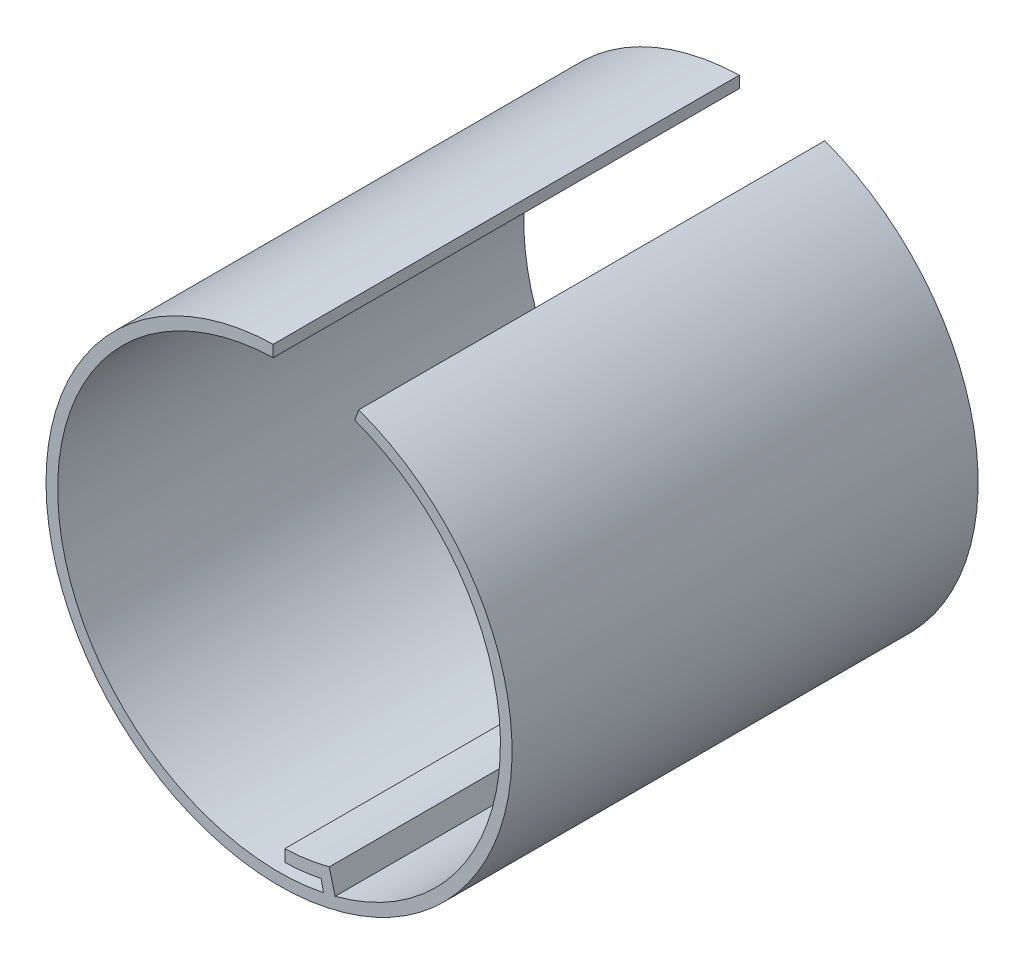
ISO-10303-21;
HEADER;
FILE_DESCRIPTION(('STEP AP214'),'2;1');
FILE_NAME('part.step','',(''),(''),'','','');
FILE_SCHEMA(('AUTOMOTIVE_DESIGN { 1 0 10303 214 1 1 1 1 }'));
ENDSEC;
DATA;
#1=APPLICATION_CONTEXT('core data for automotive mechanical design processes');
#2=APPLICATION_PROTOCOL_DEFINITION('international standard','automotive_design',2000,#1);
#3=PRODUCT_CONTEXT('',#1,'mechanical');
#4=PRODUCT('Part','Part','',(#3));
#5=PRODUCT_RELATED_PRODUCT_CATEGORY('part','',(#4));
#6=PRODUCT_DEFINITION_FORMATION('','',#4);
#7=PRODUCT_DEFINITION_CONTEXT('part definition',#1,'design');
#8=PRODUCT_DEFINITION('design','',#6,#7);
#9=PRODUCT_DEFINITION_SHAPE('','',#8);
#10=(LENGTH_UNIT() NAMED_UNIT(*) SI_UNIT(.MILLI.,.METRE.));
#11=(NAMED_UNIT(*) PLANE_ANGLE_UNIT() SI_UNIT($,.RADIAN.));
#12=(NAMED_UNIT(*) SI_UNIT($,.STERADIAN.) SOLID_ANGLE_UNIT());
#13=UNCERTAINTY_MEASURE_WITH_UNIT(LENGTH_MEASURE(1.E-05),#10,'distance_accuracy_value','');
#14=(GEOMETRIC_REPRESENTATION_CONTEXT(3) GLOBAL_UNCERTAINTY_ASSIGNED_CONTEXT((#13)) GLOBAL_UNIT_ASSIGNED_CONTEXT((#10,
#11,#12)) REPRESENTATION_CONTEXT('',''));
#15=CARTESIAN_POINT('',(0.,0.,0.));
#16=DIRECTION('',(0.,0.,1.));
#17=DIRECTION('',(1.,0.,0.));
#18=AXIS2_PLACEMENT_3D('',#15,#16,#17);
#19=CARTESIAN_POINT('',(0.,0.,101.6));
#20=DIRECTION('',(0.,0.,-1.));
#21=DIRECTION('',(-1.,0.,0.));
#22=AXIS2_PLACEMENT_3D('',#19,#20,#21);
#23=CYLINDRICAL_SURFACE('',#22,50.8);
#24=CARTESIAN_POINT('',(0.,0.,0.));
#25=DIRECTION('',(0.,0.,1.));
#26=DIRECTION('',(1.,0.,0.));
#27=AXIS2_PLACEMENT_3D('',#24,#25,#26);
#28=CIRCLE('',#27,50.8);
#29=CARTESIAN_POINT('',(-1.27,50.7841225187558,0.));
#30=VERTEX_POINT('',#29);
#31=CARTESIAN_POINT('',(17.3746232809444,47.7363851359241,0.));
#32=VERTEX_POINT('',#31);
#33=EDGE_CURVE('E166',#30,#32,#28,.T.);
#34=ORIENTED_EDGE('',*,*,#33,.T.);
#35=DIRECTION('',(0.,0.,-1.));
#36=VECTOR('',#35,1.);
#37=CARTESIAN_POINT('',(17.3746232809444,47.7363851359241,101.6));
#38=LINE('',#37,#36);
#39=CARTESIAN_POINT('',(17.3746232809444,47.7363851359241,101.6));
#40=VERTEX_POINT('',#39);
#41=EDGE_CURVE('E13',#40,#32,#38,.T.);
#42=ORIENTED_EDGE('',*,*,#41,.F.);
#43=CARTESIAN_POINT('',(0.,0.,101.6));
#44=DIRECTION('',(0.,0.,1.));
#45=DIRECTION('',(1.,0.,0.));
#46=AXIS2_PLACEMENT_3D('',#43,#44,#45);
#47=CIRCLE('',#46,50.8);
#48=CARTESIAN_POINT('',(-1.27,50.7841225187558,101.6));
#49=VERTEX_POINT('',#48);
#50=EDGE_CURVE('E194',#49,#40,#47,.T.);
#51=ORIENTED_EDGE('',*,*,#50,.F.);
#52=DIRECTION('',(0.,0.,-1.));
#53=VECTOR('',#52,1.);
#54=CARTESIAN_POINT('',(-1.27,50.7841225187558,101.6));
#55=LINE('',#54,#53);
#56=EDGE_CURVE('E162',#49,#30,#55,.T.);
#57=ORIENTED_EDGE('',*,*,#56,.T.);
#58=EDGE_LOOP('',(#34,#42,#51,#57));
#59=FACE_BOUND('',#58,.T.);
#60=ADVANCED_FACE('F53',(#59),#23,.T.);
#61=CARTESIAN_POINT('',(16.5058921168971,45.3495658791278,101.6));
#62=DIRECTION('',(0.939692620785906,-0.342020143325676,0.));
#63=DIRECTION('',(0.342020143325676,0.939692620785906,0.));
#64=AXIS2_PLACEMENT_3D('',#61,#62,#63);
#65=PLANE('',#64);
#66=DIRECTION('',(-0.342020143325676,-0.939692620785906,0.));
#67=VECTOR('',#66,1.);
#68=CARTESIAN_POINT('',(16.5058921168971,45.3495658791278,0.));
#69=LINE('',#68,#67);
#70=CARTESIAN_POINT('',(16.5058921168971,45.3495658791278,0.));
#71=VERTEX_POINT('',#70);
#72=EDGE_CURVE('E170',#32,#71,#69,.T.);
#73=ORIENTED_EDGE('',*,*,#72,.T.);
#74=DIRECTION('',(0.,0.,-1.));
#75=VECTOR('',#74,1.);
#76=CARTESIAN_POINT('',(16.5058921168971,45.3495658791278,101.6));
#77=LINE('',#76,#75);
#78=CARTESIAN_POINT('',(16.5058921168971,45.3495658791278,101.6));
#79=VERTEX_POINT('',#78);
#80=EDGE_CURVE('E62',#79,#71,#77,.T.);
#81=ORIENTED_EDGE('',*,*,#80,.F.);
#82=DIRECTION('',(-0.342020143325676,-0.939692620785906,0.));
#83=VECTOR('',#82,1.);
#84=CARTESIAN_POINT('',(16.5058921168971,45.3495658791278,101.6));
#85=LINE('',#84,#83);
#86=EDGE_CURVE('E118',#40,#79,#85,.T.);
#87=ORIENTED_EDGE('',*,*,#86,.F.);
#88=ORIENTED_EDGE('',*,*,#41,.T.);
#89=EDGE_LOOP('',(#73,#81,#87,#88));
#90=FACE_BOUND('',#89,.T.);
#91=ADVANCED_FACE('F258',(#90),#65,.F.);
#92=CARTESIAN_POINT('',(0.,0.,101.6));
#93=DIRECTION('',(0.,0.,-1.));
#94=DIRECTION('',(-1.,0.,0.));
#95=AXIS2_PLACEMENT_3D('',#92,#93,#94);
#96=CYLINDRICAL_SURFACE('',#95,48.26);
#97=CARTESIAN_POINT('',(0.,0.,0.));
#98=DIRECTION('',(0.,0.,-1.));
#99=DIRECTION('',(1.,0.,0.));
#100=AXIS2_PLACEMENT_3D('',#97,#98,#99);
#101=CIRCLE('',#100,48.26);
#102=CARTESIAN_POINT('',(12.2344736384849,-46.6834580423218,0.));
#103=VERTEX_POINT('',#102);
#104=EDGE_CURVE('E173',#71,#103,#101,.T.);
#105=ORIENTED_EDGE('',*,*,#104,.T.);
#106=DIRECTION('',(0.,0.,-1.));
#107=VECTOR('',#106,1.);
#108=CARTESIAN_POINT('',(12.2344736384849,-46.6834580423218,101.6));
#109=LINE('',#108,#107);
#110=CARTESIAN_POINT('',(12.2344736384849,-46.6834580423218,101.6));
#111=VERTEX_POINT('',#110);
#112=EDGE_CURVE('E213',#111,#103,#109,.T.);
#113=ORIENTED_EDGE('',*,*,#112,.F.);
#114=CARTESIAN_POINT('',(0.,0.,101.6));
#115=DIRECTION('',(0.,0.,-1.));
#116=DIRECTION('',(1.,0.,0.));
#117=AXIS2_PLACEMENT_3D('',#114,#115,#116);
#118=CIRCLE('',#117,48.26);
#119=EDGE_CURVE('E223',#79,#111,#118,.T.);
#120=ORIENTED_EDGE('',*,*,#119,.F.);
#121=ORIENTED_EDGE('',*,*,#80,.T.);
#122=EDGE_LOOP('',(#105,#113,#120,#121));
#123=FACE_BOUND('',#122,.T.);
#124=ADVANCED_FACE('F221',(#123),#96,.F.);
#125=CARTESIAN_POINT('',(10.9466343081181,-41.7694098273405,101.6));
#126=DIRECTION('',(-0.967332325783709,-0.253511679206069,0.));
#127=DIRECTION('',(0.253511679206069,-0.967332325783709,0.));
#128=AXIS2_PLACEMENT_3D('',#125,#126,#127);
#129=PLANE('',#128);
#130=DIRECTION('',(-0.253511679206069,0.967332325783709,0.));
#131=VECTOR('',#130,1.);
#132=CARTESIAN_POINT('',(10.9466343081181,-41.7694098273405,0.));
#133=LINE('',#132,#131);
#134=CARTESIAN_POINT('',(10.9466343081181,-41.7694098273405,0.));
#135=VERTEX_POINT('',#134);
#136=EDGE_CURVE('E176',#103,#135,#133,.T.);
#137=ORIENTED_EDGE('',*,*,#136,.T.);
#138=DIRECTION('',(0.,0.,-1.));
#139=VECTOR('',#138,1.);
#140=CARTESIAN_POINT('',(10.9466343081181,-41.7694098273405,101.6));
#141=LINE('',#140,#139);
#142=CARTESIAN_POINT('',(10.9466343081181,-41.7694098273405,101.6));
#143=VERTEX_POINT('',#142);
#144=EDGE_CURVE('E209',#143,#135,#141,.T.);
#145=ORIENTED_EDGE('',*,*,#144,.F.);
#146=DIRECTION('',(-0.253511679206069,0.967332325783709,0.));
#147=VECTOR('',#146,1.);
#148=CARTESIAN_POINT('',(10.9466343081181,-41.7694098273405,101.6));
#149=LINE('',#148,#147);
#150=EDGE_CURVE('E242',#111,#143,#149,.T.);
#151=ORIENTED_EDGE('',*,*,#150,.F.);
#152=ORIENTED_EDGE('',*,*,#112,.T.);
#153=EDGE_LOOP('',(#137,#145,#151,#152));
#154=FACE_BOUND('',#153,.T.);
#155=ADVANCED_FACE('F232',(#154),#129,.F.);
#156=CARTESIAN_POINT('',(0.,0.,101.6));
#157=DIRECTION('',(0.,0.,-1.));
#158=DIRECTION('',(-1.,0.,0.));
#159=AXIS2_PLACEMENT_3D('',#156,#157,#158);
#160=CYLINDRICAL_SURFACE('',#159,43.18);
#161=CARTESIAN_POINT('',(0.,0.,0.));
#162=DIRECTION('',(0.,0.,-1.));
#163=DIRECTION('',(1.,0.,0.));
#164=AXIS2_PLACEMENT_3D('',#161,#162,#163);
#165=CIRCLE('',#164,43.18);
#166=CARTESIAN_POINT('',(1.27,-43.1613194886347,0.));
#167=VERTEX_POINT('',#166);
#168=EDGE_CURVE('E179',#135,#167,#165,.T.);
#169=ORIENTED_EDGE('',*,*,#168,.T.);
#170=DIRECTION('',(0.,0.,-1.));
#171=VECTOR('',#170,1.);
#172=CARTESIAN_POINT('',(1.27,-43.1613194886347,101.6));
#173=LINE('',#172,#171);
#174=CARTESIAN_POINT('',(1.27,-43.1613194886347,101.6));
#175=VERTEX_POINT('',#174);
#176=EDGE_CURVE('E205',#175,#167,#173,.T.);
#177=ORIENTED_EDGE('',*,*,#176,.F.);
#178=CARTESIAN_POINT('',(0.,0.,101.6));
#179=DIRECTION('',(0.,0.,-1.));
#180=DIRECTION('',(1.,0.,0.));
#181=AXIS2_PLACEMENT_3D('',#178,#179,#180);
#182=CIRCLE('',#181,43.18);
#183=EDGE_CURVE('E238',#143,#175,#182,.T.);
#184=ORIENTED_EDGE('',*,*,#183,.F.);
#185=ORIENTED_EDGE('',*,*,#144,.T.);
#186=EDGE_LOOP('',(#169,#177,#184,#185));
#187=FACE_BOUND('',#186,.T.);
#188=ADVANCED_FACE('F236',(#187),#160,.F.);
#189=CARTESIAN_POINT('',(1.27,-43.1613194886347,101.6));
#190=DIRECTION('',(1.,0.,0.));
#191=DIRECTION('',(0.,0.,-1.));
#192=AXIS2_PLACEMENT_3D('',#189,#190,#191);
#193=PLANE('',#192);
#194=DIRECTION('',(0.,-1.,0.));
#195=VECTOR('',#194,1.);
#196=CARTESIAN_POINT('',(1.27,-43.1613194886347,0.));
#197=LINE('',#196,#195);
#198=CARTESIAN_POINT('',(1.26999999999999,-45.7760901075028,0.));
#199=VERTEX_POINT('',#198);
#200=EDGE_CURVE('E182',#167,#199,#197,.T.);
#201=ORIENTED_EDGE('',*,*,#200,.T.);
#202=DIRECTION('',(0.,0.,-1.));
#203=VECTOR('',#202,1.);
#204=CARTESIAN_POINT('',(1.26999999999999,-45.7760901075028,101.6));
#205=LINE('',#204,#203);
#206=CARTESIAN_POINT('',(1.26999999999999,-45.7760901075028,101.6));
#207=VERTEX_POINT('',#206);
#208=EDGE_CURVE('E201',#207,#199,#205,.T.);
#209=ORIENTED_EDGE('',*,*,#208,.F.);
#210=DIRECTION('',(0.,-1.,0.));
#211=VECTOR('',#210,1.);
#212=CARTESIAN_POINT('',(1.27,-43.1613194886347,101.6));
#213=LINE('',#212,#211);
#214=EDGE_CURVE('E241',#175,#207,#213,.T.);
#215=ORIENTED_EDGE('',*,*,#214,.F.);
#216=ORIENTED_EDGE('',*,*,#176,.T.);
#217=EDGE_LOOP('',(#201,#209,#215,#216));
#218=FACE_BOUND('',#217,.T.);
#219=ADVANCED_FACE('F270',(#218),#193,.F.);
#220=CARTESIAN_POINT('',(0.,0.,101.6));
#221=DIRECTION('',(0.,0.,-1.));
#222=DIRECTION('',(-1.,0.,0.));
#223=AXIS2_PLACEMENT_3D('',#220,#221,#222);
#224=CYLINDRICAL_SURFACE('',#223,45.7937039944381);
#225=CARTESIAN_POINT('',(0.,0.,0.));
#226=DIRECTION('',(0.,0.,1.));
#227=DIRECTION('',(1.,0.,0.));
#228=AXIS2_PLACEMENT_3D('',#225,#226,#227);
#229=CIRCLE('',#228,45.7937039944381);
#230=CARTESIAN_POINT('',(9.20116617503984,-44.8598023463046,0.));
#231=VERTEX_POINT('',#230);
#232=EDGE_CURVE('E185',#199,#231,#229,.T.);
#233=ORIENTED_EDGE('',*,*,#232,.T.);
#234=DIRECTION('',(0.,0.,-1.));
#235=VECTOR('',#234,1.);
#236=CARTESIAN_POINT('',(9.20116617503984,-44.8598023463046,101.6));
#237=LINE('',#236,#235);
#238=CARTESIAN_POINT('',(9.20116617503984,-44.8598023463046,101.6));
#239=VERTEX_POINT('',#238);
#240=EDGE_CURVE('E155',#239,#231,#237,.T.);
#241=ORIENTED_EDGE('',*,*,#240,.F.);
#242=CARTESIAN_POINT('',(0.,0.,101.6));
#243=DIRECTION('',(0.,0.,1.));
#244=DIRECTION('',(1.,0.,0.));
#245=AXIS2_PLACEMENT_3D('',#242,#243,#244);
#246=CIRCLE('',#245,45.7937039944381);
#247=EDGE_CURVE('E143',#207,#239,#246,.T.);
#248=ORIENTED_EDGE('',*,*,#247,.F.);
#249=ORIENTED_EDGE('',*,*,#208,.T.);
#250=EDGE_LOOP('',(#233,#241,#248,#249));
#251=FACE_BOUND('',#250,.T.);
#252=ADVANCED_FACE('F273',(#251),#224,.T.);
#253=CARTESIAN_POINT('',(9.20116617503984,-44.8598023463046,101.6));
#254=DIRECTION('',(0.979606330856161,0.20092644561264,0.));
#255=DIRECTION('',(-0.20092644561264,0.979606330856161,0.));
#256=AXIS2_PLACEMENT_3D('',#253,#254,#255);
#257=PLANE('',#256);
#258=DIRECTION('',(0.20092644561264,-0.979606330856161,0.));
#259=VECTOR('',#258,1.);
#260=CARTESIAN_POINT('',(9.20116617503984,-44.8598023463046,0.));
#261=LINE('',#260,#259);
#262=CARTESIAN_POINT('',(9.69671026526603,-47.2758015271183,0.));
#263=VERTEX_POINT('',#262);
#264=EDGE_CURVE('E153',#231,#263,#261,.T.);
#265=ORIENTED_EDGE('',*,*,#264,.T.);
#266=DIRECTION('',(0.,0.,-1.));
#267=VECTOR('',#266,1.);
#268=CARTESIAN_POINT('',(9.69671026526603,-47.2758015271183,101.6));
#269=LINE('',#268,#267);
#270=CARTESIAN_POINT('',(9.69671026526603,-47.2758015271183,101.6));
#271=VERTEX_POINT('',#270);
#272=EDGE_CURVE('E150',#271,#263,#269,.T.);
#273=ORIENTED_EDGE('',*,*,#272,.F.);
#274=DIRECTION('',(0.20092644561264,-0.979606330856161,0.));
#275=VECTOR('',#274,1.);
#276=CARTESIAN_POINT('',(9.20116617503984,-44.8598023463046,101.6));
#277=LINE('',#276,#275);
#278=EDGE_CURVE('E137',#239,#271,#277,.T.);
#279=ORIENTED_EDGE('',*,*,#278,.F.);
#280=ORIENTED_EDGE('',*,*,#240,.T.);
#281=EDGE_LOOP('',(#265,#273,#279,#280));
#282=FACE_BOUND('',#281,.T.);
#283=ADVANCED_FACE('F151',(#282),#257,.F.);
#284=CARTESIAN_POINT('',(0.,0.,101.6));
#285=DIRECTION('',(0.,0.,-1.));
#286=DIRECTION('',(-1.,0.,0.));
#287=AXIS2_PLACEMENT_3D('',#284,#285,#286);
#288=CYLINDRICAL_SURFACE('',#287,48.26);
#289=CARTESIAN_POINT('',(0.,0.,0.));
#290=DIRECTION('',(0.,0.,-1.));
#291=DIRECTION('',(-1.,0.,0.));
#292=AXIS2_PLACEMENT_3D('',#289,#290,#291);
#293=CIRCLE('',#292,48.26);
#294=CARTESIAN_POINT('',(-1.27,48.2432865795854,0.));
#295=VERTEX_POINT('',#294);
#296=EDGE_CURVE('E104',#263,#295,#293,.T.);
#297=ORIENTED_EDGE('',*,*,#296,.T.);
#298=DIRECTION('',(0.,0.,-1.));
#299=VECTOR('',#298,1.);
#300=CARTESIAN_POINT('',(-1.27,48.2432865795854,101.6));
#301=LINE('',#300,#299);
#302=CARTESIAN_POINT('',(-1.27,48.2432865795854,101.6));
#303=VERTEX_POINT('',#302);
#304=EDGE_CURVE('E156',#303,#295,#301,.T.);
#305=ORIENTED_EDGE('',*,*,#304,.F.);
#306=CARTESIAN_POINT('',(0.,0.,101.6));
#307=DIRECTION('',(0.,0.,-1.));
#308=DIRECTION('',(1.,0.,0.));
#309=AXIS2_PLACEMENT_3D('',#306,#307,#308);
#310=CIRCLE('',#309,48.26);
#311=EDGE_CURVE('E141',#271,#303,#310,.T.);
#312=ORIENTED_EDGE('',*,*,#311,.F.);
#313=ORIENTED_EDGE('',*,*,#272,.T.);
#314=EDGE_LOOP('',(#297,#305,#312,#313));
#315=FACE_BOUND('',#314,.T.);
#316=ADVANCED_FACE('F158',(#315),#288,.F.);
#317=CARTESIAN_POINT('',(-1.27,50.7841225187558,101.6));
#318=DIRECTION('',(-1.,0.,0.));
#319=DIRECTION('',(0.,-1.,0.));
#320=AXIS2_PLACEMENT_3D('',#317,#318,#319);
#321=PLANE('',#320);
#322=DIRECTION('',(0.,1.,0.));
#323=VECTOR('',#322,1.);
#324=CARTESIAN_POINT('',(-1.27,50.7841225187558,0.));
#325=LINE('',#324,#323);
#326=EDGE_CURVE('E110',#295,#30,#325,.T.);
#327=ORIENTED_EDGE('',*,*,#326,.T.);
#328=ORIENTED_EDGE('',*,*,#56,.F.);
#329=DIRECTION('',(0.,1.,0.));
#330=VECTOR('',#329,1.);
#331=CARTESIAN_POINT('',(-1.27,50.7841225187558,101.6));
#332=LINE('',#331,#330);
#333=EDGE_CURVE('E70',#303,#49,#332,.T.);
#334=ORIENTED_EDGE('',*,*,#333,.F.);
#335=ORIENTED_EDGE('',*,*,#304,.T.);
#336=EDGE_LOOP('',(#327,#328,#334,#335));
#337=FACE_BOUND('',#336,.T.);
#338=ADVANCED_FACE('F282',(#337),#321,.F.);
#339=CARTESIAN_POINT('',(0.,0.,101.6));
#340=DIRECTION('',(0.,0.,1.));
#341=DIRECTION('',(1.,0.,0.));
#342=AXIS2_PLACEMENT_3D('',#339,#340,#341);
#343=PLANE('',#342);
#344=ORIENTED_EDGE('',*,*,#50,.T.);
#345=ORIENTED_EDGE('',*,*,#86,.T.);
#346=ORIENTED_EDGE('',*,*,#119,.T.);
#347=ORIENTED_EDGE('',*,*,#150,.T.);
#348=ORIENTED_EDGE('',*,*,#183,.T.);
#349=ORIENTED_EDGE('',*,*,#214,.T.);
#350=ORIENTED_EDGE('',*,*,#247,.T.);
#351=ORIENTED_EDGE('',*,*,#278,.T.);
#352=ORIENTED_EDGE('',*,*,#311,.T.);
#353=ORIENTED_EDGE('',*,*,#333,.T.);
#354=EDGE_LOOP('',(#344,#345,#346,#347,#348,#349,#350,#351,#352,#353));
#355=FACE_BOUND('',#354,.T.);
#356=ADVANCED_FACE('F139',(#355),#343,.T.);
#357=CARTESIAN_POINT('',(0.,0.,0.));
#358=DIRECTION('',(0.,0.,1.));
#359=DIRECTION('',(1.,0.,0.));
#360=AXIS2_PLACEMENT_3D('',#357,#358,#359);
#361=PLANE('',#360);
#362=ORIENTED_EDGE('',*,*,#33,.F.);
#363=ORIENTED_EDGE('',*,*,#326,.F.);
#364=ORIENTED_EDGE('',*,*,#296,.F.);
#365=ORIENTED_EDGE('',*,*,#264,.F.);
#366=ORIENTED_EDGE('',*,*,#232,.F.);
#367=ORIENTED_EDGE('',*,*,#200,.F.);
#368=ORIENTED_EDGE('',*,*,#168,.F.);
#369=ORIENTED_EDGE('',*,*,#136,.F.);
#370=ORIENTED_EDGE('',*,*,#104,.F.);
#371=ORIENTED_EDGE('',*,*,#72,.F.);
#372=EDGE_LOOP('',(#362,#363,#364,#365,#366,#367,#368,#369,#370,#371));
#373=FACE_BOUND('',#372,.T.);
#374=ADVANCED_FACE('F227',(#373),#361,.F.);
#375=CLOSED_SHELL('',(#60,#91,#124,#155,#188,#219,#252,#283,#316,#338,#356,#374));
#376=MANIFOLD_SOLID_BREP('B2',#375);
#377=ADVANCED_BREP_SHAPE_REPRESENTATION('',(#18,#376),#14);
#378=SHAPE_DEFINITION_REPRESENTATION(#9,#377);
ENDSEC;
END-ISO-10303-21;
